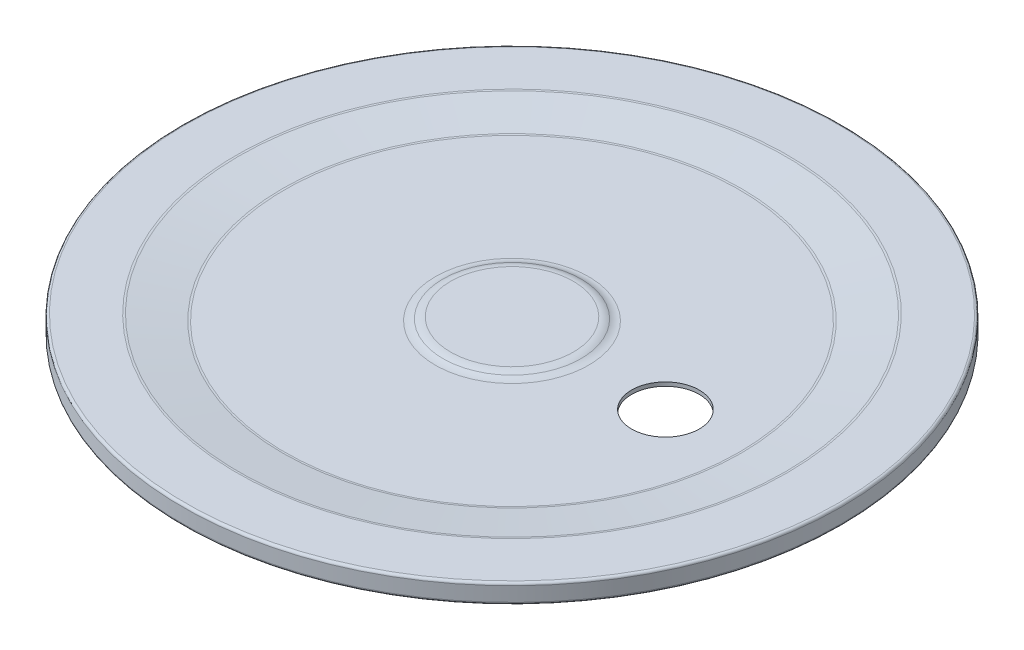
ISO-10303-21;
HEADER;
FILE_DESCRIPTION(('STEP AP214'),'2;1');
FILE_NAME('part.step','',(''),(''),'','','');
FILE_SCHEMA(('AUTOMOTIVE_DESIGN { 1 0 10303 214 1 1 1 1 }'));
ENDSEC;
DATA;
#1=APPLICATION_CONTEXT('core data for automotive mechanical design processes');
#2=APPLICATION_PROTOCOL_DEFINITION('international standard','automotive_design',2000,#1);
#3=PRODUCT_CONTEXT('',#1,'mechanical');
#4=PRODUCT('Part','Part','',(#3));
#5=PRODUCT_RELATED_PRODUCT_CATEGORY('part','',(#4));
#6=PRODUCT_DEFINITION_FORMATION('','',#4);
#7=PRODUCT_DEFINITION_CONTEXT('part definition',#1,'design');
#8=PRODUCT_DEFINITION('design','',#6,#7);
#9=PRODUCT_DEFINITION_SHAPE('','',#8);
#10=(LENGTH_UNIT() NAMED_UNIT(*) SI_UNIT(.MILLI.,.METRE.));
#11=(NAMED_UNIT(*) PLANE_ANGLE_UNIT() SI_UNIT($,.RADIAN.));
#12=(NAMED_UNIT(*) SI_UNIT($,.STERADIAN.) SOLID_ANGLE_UNIT());
#13=UNCERTAINTY_MEASURE_WITH_UNIT(LENGTH_MEASURE(1.E-05),#10,'distance_accuracy_value','');
#14=(GEOMETRIC_REPRESENTATION_CONTEXT(3) GLOBAL_UNCERTAINTY_ASSIGNED_CONTEXT((#13)) GLOBAL_UNIT_ASSIGNED_CONTEXT((#10,
#11,#12)) REPRESENTATION_CONTEXT('',''));
#15=CARTESIAN_POINT('',(0.,0.,0.));
#16=DIRECTION('',(0.,0.,1.));
#17=DIRECTION('',(1.,0.,0.));
#18=AXIS2_PLACEMENT_3D('',#15,#16,#17);
#19=CARTESIAN_POINT('',(0.,81.3593749999999,0.));
#20=DIRECTION('',(0.,1.,0.));
#21=DIRECTION('',(-1.,0.,0.));
#22=AXIS2_PLACEMENT_3D('',#19,#20,#21);
#23=CONICAL_SURFACE('',#22,28.4113417745367,1.4382447944982);
#24=CARTESIAN_POINT('',(0.,81.295875,0.));
#25=DIRECTION('',(0.,1.,0.));
#26=DIRECTION('',(-1.,0.,0.));
#27=AXIS2_PLACEMENT_3D('',#24,#25,#26);
#28=CIRCLE('',#27,27.9350917745368);
#29=CARTESIAN_POINT('',(-27.9350917745368,81.2958749999999,0.));
#30=VERTEX_POINT('',#29);
#31=EDGE_CURVE('E72',#30,#30,#28,.T.);
#32=ORIENTED_EDGE('',*,*,#31,.F.);
#33=EDGE_LOOP('',(#32));
#34=FACE_BOUND('',#33,.T.);
#35=CARTESIAN_POINT('',(0.,81.3593749999999,0.));
#36=DIRECTION('',(0.,1.,0.));
#37=DIRECTION('',(-1.,0.,0.));
#38=AXIS2_PLACEMENT_3D('',#35,#36,#37);
#39=CIRCLE('',#38,28.4113417745367);
#40=CARTESIAN_POINT('',(-28.4113417745367,81.3593749999999,0.));
#41=VERTEX_POINT('',#40);
#42=EDGE_CURVE('E11',#41,#41,#39,.T.);
#43=ORIENTED_EDGE('',*,*,#42,.T.);
#44=EDGE_LOOP('',(#43));
#45=FACE_BOUND('',#44,.T.);
#46=ADVANCED_FACE('F50',(#34,#45),#23,.F.);
#47=CARTESIAN_POINT('',(28.4113417745367,81.359375,0.));
#48=DIRECTION('',(0.,-1.,0.));
#49=DIRECTION('',(1.,0.,0.));
#50=AXIS2_PLACEMENT_3D('',#47,#48,#49);
#51=PLANE('',#50);
#52=ORIENTED_EDGE('',*,*,#42,.F.);
#53=EDGE_LOOP('',(#52));
#54=FACE_BOUND('',#53,.T.);
#55=CARTESIAN_POINT('',(0.,81.3593749999999,0.));
#56=DIRECTION('',(0.,1.,0.));
#57=DIRECTION('',(-1.,0.,0.));
#58=AXIS2_PLACEMENT_3D('',#55,#56,#57);
#59=CIRCLE('',#58,33.703125);
#60=CARTESIAN_POINT('',(-33.703125,81.3593749999999,0.));
#61=VERTEX_POINT('',#60);
#62=EDGE_CURVE('E56',#61,#61,#59,.T.);
#63=ORIENTED_EDGE('',*,*,#62,.T.);
#64=EDGE_LOOP('',(#63));
#65=FACE_BOUND('',#64,.T.);
#66=ADVANCED_FACE('F79',(#54,#65),#51,.F.);
#67=CARTESIAN_POINT('',(0.,82.55,0.));
#68=DIRECTION('',(0.,1.,0.));
#69=DIRECTION('',(-1.,0.,0.));
#70=AXIS2_PLACEMENT_3D('',#67,#68,#69);
#71=CYLINDRICAL_SURFACE('',#70,33.703125);
#72=ORIENTED_EDGE('',*,*,#62,.F.);
#73=EDGE_LOOP('',(#72));
#74=FACE_BOUND('',#73,.T.);
#75=CARTESIAN_POINT('',(0.,80.0893749999999,0.));
#76=DIRECTION('',(0.,1.,0.));
#77=DIRECTION('',(-1.,0.,0.));
#78=AXIS2_PLACEMENT_3D('',#75,#76,#77);
#79=CIRCLE('',#78,33.703125);
#80=CARTESIAN_POINT('',(-33.7031250000001,80.0893749999999,0.));
#81=VERTEX_POINT('',#80);
#82=EDGE_CURVE('E60',#81,#81,#79,.T.);
#83=ORIENTED_EDGE('',*,*,#82,.T.);
#84=EDGE_LOOP('',(#83));
#85=FACE_BOUND('',#84,.T.);
#86=ADVANCED_FACE('F83',(#74,#85),#71,.T.);
#87=CARTESIAN_POINT('',(0.,80.089375,0.));
#88=DIRECTION('',(0.,1.,0.));
#89=DIRECTION('',(-1.,0.,0.));
#90=AXIS2_PLACEMENT_3D('',#87,#88,#89);
#91=TOROIDAL_SURFACE('',#90,28.92475,4.77837500000007);
#92=ORIENTED_EDGE('',*,*,#82,.F.);
#93=EDGE_LOOP('',(#92));
#94=FACE_BOUND('',#93,.T.);
#95=CARTESIAN_POINT('',(0.,81.1983494027303,0.));
#96=DIRECTION('',(0.,1.,0.));
#97=DIRECTION('',(-1.,0.,0.));
#98=AXIS2_PLACEMENT_3D('',#95,#96,#97);
#99=CIRCLE('',#98,33.5726574232082);
#100=CARTESIAN_POINT('',(-33.5726574232082,81.1983494027303,0.));
#101=VERTEX_POINT('',#100);
#102=EDGE_CURVE('E64',#101,#101,#99,.T.);
#103=ORIENTED_EDGE('',*,*,#102,.T.);
#104=EDGE_LOOP('',(#103));
#105=FACE_BOUND('',#104,.T.);
#106=ADVANCED_FACE('F88',(#94,#105),#91,.F.);
#107=CARTESIAN_POINT('',(0.,81.1688749999999,0.));
#108=DIRECTION('',(0.,1.,0.));
#109=DIRECTION('',(-1.,0.,0.));
#110=AXIS2_PLACEMENT_3D('',#107,#108,#109);
#111=TOROIDAL_SURFACE('',#110,33.449125,0.127000000000006);
#112=ORIENTED_EDGE('',*,*,#102,.F.);
#113=EDGE_LOOP('',(#112));
#114=FACE_BOUND('',#113,.T.);
#115=CARTESIAN_POINT('',(0.,81.295875,0.));
#116=DIRECTION('',(0.,1.,0.));
#117=DIRECTION('',(-1.,0.,0.));
#118=AXIS2_PLACEMENT_3D('',#115,#116,#117);
#119=CIRCLE('',#118,33.449125);
#120=CARTESIAN_POINT('',(-33.4491250000001,81.2958749999999,0.));
#121=VERTEX_POINT('',#120);
#122=EDGE_CURVE('E69',#121,#121,#119,.T.);
#123=ORIENTED_EDGE('',*,*,#122,.T.);
#124=EDGE_LOOP('',(#123));
#125=FACE_BOUND('',#124,.T.);
#126=ADVANCED_FACE('F94',(#114,#125),#111,.F.);
#127=CARTESIAN_POINT('',(27.9350917745368,81.295875,0.));
#128=DIRECTION('',(0.,1.,0.));
#129=DIRECTION('',(-1.,0.,0.));
#130=AXIS2_PLACEMENT_3D('',#127,#128,#129);
#131=PLANE('',#130);
#132=ORIENTED_EDGE('',*,*,#122,.F.);
#133=EDGE_LOOP('',(#132));
#134=FACE_BOUND('',#133,.T.);
#135=ORIENTED_EDGE('',*,*,#31,.T.);
#136=EDGE_LOOP('',(#135));
#137=FACE_BOUND('',#136,.T.);
#138=ADVANCED_FACE('F76',(#134,#137),#131,.F.);
#139=CLOSED_SHELL('',(#46,#66,#86,#106,#126,#138));
#140=MANIFOLD_SOLID_BREP('B2',#139);
#141=CARTESIAN_POINT('',(0.,81.50225,0.));
#142=DIRECTION('',(0.,-1.,0.));
#143=DIRECTION('',(1.,0.,0.));
#144=AXIS2_PLACEMENT_3D('',#141,#142,#143);
#145=PLANE('',#144);
#146=CARTESIAN_POINT('',(0.,81.5022499999999,0.));
#147=DIRECTION('',(0.,1.,0.));
#148=DIRECTION('',(-1.,0.,0.));
#149=AXIS2_PLACEMENT_3D('',#146,#147,#148);
#150=CIRCLE('',#149,6.35000000000003);
#151=CARTESIAN_POINT('',(-6.35000000000006,81.5022499999999,0.));
#152=VERTEX_POINT('',#151);
#153=EDGE_CURVE('E219',#152,#152,#150,.T.);
#154=ORIENTED_EDGE('',*,*,#153,.T.);
#155=EDGE_LOOP('',(#154));
#156=FACE_BOUND('',#155,.T.);
#157=ADVANCED_FACE('F155',(#156),#145,.F.);
#158=CARTESIAN_POINT('',(0.,79.7533541666666,0.));
#159=DIRECTION('',(0.,1.,0.));
#160=DIRECTION('',(-1.,0.,0.));
#161=AXIS2_PLACEMENT_3D('',#158,#159,#160);
#162=TOROIDAL_SURFACE('',#161,6.35000000000002,1.74889583333333);
#163=ORIENTED_EDGE('',*,*,#153,.F.);
#164=EDGE_LOOP('',(#163));
#165=FACE_BOUND('',#164,.T.);
#166=CARTESIAN_POINT('',(0.,81.3117499999999,0.));
#167=DIRECTION('',(0.,1.,0.));
#168=DIRECTION('',(-1.,0.,0.));
#169=AXIS2_PLACEMENT_3D('',#166,#167,#168);
#170=CIRCLE('',#169,7.14375000000003);
#171=CARTESIAN_POINT('',(-7.14375000000005,81.3117499999999,0.));
#172=VERTEX_POINT('',#171);
#173=EDGE_CURVE('E223',#172,#172,#170,.T.);
#174=ORIENTED_EDGE('',*,*,#173,.T.);
#175=EDGE_LOOP('',(#174));
#176=FACE_BOUND('',#175,.T.);
#177=ADVANCED_FACE('F269',(#165,#176),#162,.T.);
#178=CARTESIAN_POINT('',(0.,82.8701458333333,0.));
#179=DIRECTION('',(0.,1.,0.));
#180=DIRECTION('',(-1.,0.,0.));
#181=AXIS2_PLACEMENT_3D('',#178,#179,#180);
#182=TOROIDAL_SURFACE('',#181,7.93750000000003,1.74889583333333);
#183=ORIENTED_EDGE('',*,*,#173,.F.);
#184=EDGE_LOOP('',(#183));
#185=FACE_BOUND('',#184,.T.);
#186=CARTESIAN_POINT('',(0.,81.1212499999999,0.));
#187=DIRECTION('',(0.,1.,0.));
#188=DIRECTION('',(-1.,0.,0.));
#189=AXIS2_PLACEMENT_3D('',#186,#187,#188);
#190=CIRCLE('',#189,7.93750000000003);
#191=CARTESIAN_POINT('',(-7.93750000000005,81.1212499999999,0.));
#192=VERTEX_POINT('',#191);
#193=EDGE_CURVE('E227',#192,#192,#190,.T.);
#194=ORIENTED_EDGE('',*,*,#193,.T.);
#195=EDGE_LOOP('',(#194));
#196=FACE_BOUND('',#195,.T.);
#197=ADVANCED_FACE('F275',(#185,#196),#182,.F.);
#198=CARTESIAN_POINT('',(7.9375,81.1212499999999,0.));
#199=DIRECTION('',(0.,-1.,0.));
#200=DIRECTION('',(1.,0.,0.));
#201=AXIS2_PLACEMENT_3D('',#198,#199,#200);
#202=PLANE('',#201);
#203=CARTESIAN_POINT('',(15.875,81.12125,0.));
#204=DIRECTION('',(0.,1.,0.));
#205=DIRECTION('',(-1.,0.,0.));
#206=AXIS2_PLACEMENT_3D('',#203,#204,#205);
#207=CIRCLE('',#206,3.499999985);
#208=CARTESIAN_POINT('',(12.375000015,81.12125,0.));
#209=VERTEX_POINT('',#208);
#210=EDGE_CURVE('E247',#209,#209,#207,.T.);
#211=ORIENTED_EDGE('',*,*,#210,.F.);
#212=EDGE_LOOP('',(#211));
#213=FACE_BOUND('',#212,.T.);
#214=CARTESIAN_POINT('',(0.,81.1212499999999,0.));
#215=DIRECTION('',(0.,-1.,0.));
#216=DIRECTION('',(1.,0.,0.));
#217=AXIS2_PLACEMENT_3D('',#214,#215,#216);
#218=CIRCLE('',#217,23.5213475857789);
#219=CARTESIAN_POINT('',(23.5213475857789,81.12125,0.));
#220=VERTEX_POINT('',#219);
#221=EDGE_CURVE('E49',#220,#220,#218,.F.);
#222=ORIENTED_EDGE('',*,*,#221,.T.);
#223=EDGE_LOOP('',(#222));
#224=FACE_BOUND('',#223,.T.);
#225=ORIENTED_EDGE('',*,*,#193,.F.);
#226=EDGE_LOOP('',(#225));
#227=FACE_BOUND('',#226,.T.);
#228=ADVANCED_FACE('F312',(#213,#224,#227),#202,.F.);
#229=CARTESIAN_POINT('',(0.,81.7562499999999,0.));
#230=DIRECTION('',(0.,1.,0.));
#231=DIRECTION('',(-1.,0.,0.));
#232=AXIS2_PLACEMENT_3D('',#229,#230,#231);
#233=CONICAL_SURFACE('',#232,28.385,1.43824479449823);
#234=CARTESIAN_POINT('',(0.,81.7428813206403,0.));
#235=DIRECTION('',(0.,-1.,0.));
#236=DIRECTION('',(1.,0.,0.));
#237=AXIS2_PLACEMENT_3D('',#234,#235,#236);
#238=CIRCLE('',#237,28.2847349048026);
#239=CARTESIAN_POINT('',(28.2847349048025,81.7428813206403,0.));
#240=VERTEX_POINT('',#239);
#241=EDGE_CURVE('E164',#240,#240,#238,.F.);
#242=ORIENTED_EDGE('',*,*,#241,.T.);
#243=EDGE_LOOP('',(#242));
#244=FACE_BOUND('',#243,.T.);
#245=CARTESIAN_POINT('',(0.,81.1346186793596,0.));
#246=DIRECTION('',(0.,1.,0.));
#247=DIRECTION('',(-1.,0.,0.));
#248=AXIS2_PLACEMENT_3D('',#245,#246,#247);
#249=CIRCLE('',#248,23.7227650951976);
#250=CARTESIAN_POINT('',(-23.7227650951976,81.1346186793595,0.));
#251=VERTEX_POINT('',#250);
#252=EDGE_CURVE('E169',#251,#251,#249,.F.);
#253=ORIENTED_EDGE('',*,*,#252,.T.);
#254=EDGE_LOOP('',(#253));
#255=FACE_BOUND('',#254,.T.);
#256=ADVANCED_FACE('F308',(#244,#255),#233,.F.);
#257=CARTESIAN_POINT('',(28.385,81.75625,0.));
#258=DIRECTION('',(0.,-1.,0.));
#259=DIRECTION('',(1.,0.,0.));
#260=AXIS2_PLACEMENT_3D('',#257,#258,#259);
#261=PLANE('',#260);
#262=CARTESIAN_POINT('',(0.,81.7562499999999,0.));
#263=DIRECTION('',(0.,-1.,0.));
#264=DIRECTION('',(1.,0.,0.));
#265=AXIS2_PLACEMENT_3D('',#262,#263,#264);
#266=CIRCLE('',#265,33.846);
#267=CARTESIAN_POINT('',(33.846,81.75625,0.));
#268=VERTEX_POINT('',#267);
#269=EDGE_CURVE('E187',#268,#268,#266,.F.);
#270=ORIENTED_EDGE('',*,*,#269,.T.);
#271=EDGE_LOOP('',(#270));
#272=FACE_BOUND('',#271,.T.);
#273=CARTESIAN_POINT('',(0.,81.7562499999999,0.));
#274=DIRECTION('',(0.,-1.,0.));
#275=DIRECTION('',(1.,0.,0.));
#276=AXIS2_PLACEMENT_3D('',#273,#274,#275);
#277=CIRCLE('',#276,28.4861524142213);
#278=CARTESIAN_POINT('',(28.4861524142212,81.75625,0.));
#279=VERTEX_POINT('',#278);
#280=EDGE_CURVE('E191',#279,#279,#277,.T.);
#281=ORIENTED_EDGE('',*,*,#280,.T.);
#282=EDGE_LOOP('',(#281));
#283=FACE_BOUND('',#282,.T.);
#284=ADVANCED_FACE('F311',(#272,#283),#261,.F.);
#285=CARTESIAN_POINT('',(0.,82.55,0.));
#286=DIRECTION('',(0.,1.,0.));
#287=DIRECTION('',(-1.,0.,0.));
#288=AXIS2_PLACEMENT_3D('',#285,#286,#287);
#289=CYLINDRICAL_SURFACE('',#288,34.1);
#290=CARTESIAN_POINT('',(0.,80.0102499999999,0.));
#291=DIRECTION('',(0.,1.,0.));
#292=DIRECTION('',(-1.,0.,0.));
#293=AXIS2_PLACEMENT_3D('',#290,#291,#292);
#294=CIRCLE('',#293,34.1);
#295=CARTESIAN_POINT('',(-34.1000000000001,80.0102499999999,0.));
#296=VERTEX_POINT('',#295);
#297=EDGE_CURVE('E211',#296,#296,#294,.T.);
#298=ORIENTED_EDGE('',*,*,#297,.T.);
#299=EDGE_LOOP('',(#298));
#300=FACE_BOUND('',#299,.T.);
#301=CARTESIAN_POINT('',(0.,81.5022499999999,0.));
#302=DIRECTION('',(0.,-1.,0.));
#303=DIRECTION('',(1.,0.,0.));
#304=AXIS2_PLACEMENT_3D('',#301,#302,#303);
#305=CIRCLE('',#304,34.1);
#306=CARTESIAN_POINT('',(34.1,81.50225,0.));
#307=VERTEX_POINT('',#306);
#308=EDGE_CURVE('E215',#307,#307,#305,.T.);
#309=ORIENTED_EDGE('',*,*,#308,.T.);
#310=EDGE_LOOP('',(#309));
#311=FACE_BOUND('',#310,.T.);
#312=ADVANCED_FACE('F320',(#300,#311),#289,.T.);
#313=CARTESIAN_POINT('',(34.1,79.75625,0.));
#314=DIRECTION('',(0.,1.,0.));
#315=DIRECTION('',(-1.,0.,0.));
#316=AXIS2_PLACEMENT_3D('',#313,#314,#315);
#317=PLANE('',#316);
#318=CARTESIAN_POINT('',(0.,79.7562499999999,0.));
#319=DIRECTION('',(0.,1.,0.));
#320=DIRECTION('',(-1.,0.,0.));
#321=AXIS2_PLACEMENT_3D('',#318,#319,#320);
#322=CIRCLE('',#321,33.846);
#323=CARTESIAN_POINT('',(-33.8460000000001,79.7562499999999,0.));
#324=VERTEX_POINT('',#323);
#325=EDGE_CURVE('E207',#324,#324,#322,.F.);
#326=ORIENTED_EDGE('',*,*,#325,.T.);
#327=EDGE_LOOP('',(#326));
#328=FACE_BOUND('',#327,.T.);
#329=CARTESIAN_POINT('',(0.,79.7562499999999,0.));
#330=DIRECTION('',(0.,1.,0.));
#331=DIRECTION('',(-1.,0.,0.));
#332=AXIS2_PLACEMENT_3D('',#329,#330,#331);
#333=CIRCLE('',#332,33.703125);
#334=CARTESIAN_POINT('',(-33.7031250000001,79.7562499999999,0.));
#335=VERTEX_POINT('',#334);
#336=EDGE_CURVE('E231',#335,#335,#333,.T.);
#337=ORIENTED_EDGE('',*,*,#336,.T.);
#338=EDGE_LOOP('',(#337));
#339=FACE_BOUND('',#338,.T.);
#340=ADVANCED_FACE('F476',(#328,#339),#317,.F.);
#341=CARTESIAN_POINT('',(0.,82.55,0.));
#342=DIRECTION('',(0.,1.,0.));
#343=DIRECTION('',(-1.,0.,0.));
#344=AXIS2_PLACEMENT_3D('',#341,#342,#343);
#345=CYLINDRICAL_SURFACE('',#344,33.703125);
#346=CARTESIAN_POINT('',(0.,81.1053749999999,0.));
#347=DIRECTION('',(0.,1.,0.));
#348=DIRECTION('',(-1.,0.,0.));
#349=AXIS2_PLACEMENT_3D('',#346,#347,#348);
#350=CIRCLE('',#349,33.703125);
#351=CARTESIAN_POINT('',(-33.7031250000001,81.1053749999998,0.));
#352=VERTEX_POINT('',#351);
#353=EDGE_CURVE('E203',#352,#352,#350,.T.);
#354=ORIENTED_EDGE('',*,*,#353,.T.);
#355=EDGE_LOOP('',(#354));
#356=FACE_BOUND('',#355,.T.);
#357=ORIENTED_EDGE('',*,*,#336,.F.);
#358=EDGE_LOOP('',(#357));
#359=FACE_BOUND('',#358,.T.);
#360=ADVANCED_FACE('F466',(#356,#359),#345,.F.);
#361=CARTESIAN_POINT('',(28.4113417745367,81.359375,0.));
#362=DIRECTION('',(0.,1.,0.));
#363=DIRECTION('',(-1.,0.,0.));
#364=AXIS2_PLACEMENT_3D('',#361,#362,#363);
#365=PLANE('',#364);
#366=CARTESIAN_POINT('',(0.,81.3593749999999,0.));
#367=DIRECTION('',(0.,1.,0.));
#368=DIRECTION('',(-1.,0.,0.));
#369=AXIS2_PLACEMENT_3D('',#366,#367,#368);
#370=CIRCLE('',#369,33.449125);
#371=CARTESIAN_POINT('',(-33.4491250000001,81.3593749999998,0.));
#372=VERTEX_POINT('',#371);
#373=EDGE_CURVE('E195',#372,#372,#370,.F.);
#374=ORIENTED_EDGE('',*,*,#373,.T.);
#375=EDGE_LOOP('',(#374));
#376=FACE_BOUND('',#375,.T.);
#377=CARTESIAN_POINT('',(0.,81.3593749999999,0.));
#378=DIRECTION('',(0.,1.,0.));
#379=DIRECTION('',(-1.,0.,0.));
#380=AXIS2_PLACEMENT_3D('',#377,#378,#379);
#381=CIRCLE('',#380,28.512494188758);
#382=CARTESIAN_POINT('',(-28.512494188758,81.3593749999998,0.));
#383=VERTEX_POINT('',#382);
#384=EDGE_CURVE('E199',#383,#383,#381,.T.);
#385=ORIENTED_EDGE('',*,*,#384,.T.);
#386=EDGE_LOOP('',(#385));
#387=FACE_BOUND('',#386,.T.);
#388=ADVANCED_FACE('F457',(#376,#387),#365,.F.);
#389=CARTESIAN_POINT('',(0.,80.7243749999999,0.));
#390=DIRECTION('',(0.,1.,0.));
#391=DIRECTION('',(-1.,0.,0.));
#392=AXIS2_PLACEMENT_3D('',#389,#390,#391);
#393=CONICAL_SURFACE('',#392,23.6488417745368,1.43824479449823);
#394=CARTESIAN_POINT('',(0.,81.3460063206402,0.));
#395=DIRECTION('',(0.,1.,0.));
#396=DIRECTION('',(-1.,0.,0.));
#397=AXIS2_PLACEMENT_3D('',#394,#395,#396);
#398=CIRCLE('',#397,28.3110766793393);
#399=CARTESIAN_POINT('',(-28.3110766793393,81.3460063206402,0.));
#400=VERTEX_POINT('',#399);
#401=EDGE_CURVE('E179',#400,#400,#398,.F.);
#402=ORIENTED_EDGE('',*,*,#401,.T.);
#403=EDGE_LOOP('',(#402));
#404=FACE_BOUND('',#403,.T.);
#405=CARTESIAN_POINT('',(0.,80.7377436793596,0.));
#406=DIRECTION('',(0.,-1.,0.));
#407=DIRECTION('',(1.,0.,0.));
#408=AXIS2_PLACEMENT_3D('',#405,#406,#407);
#409=CIRCLE('',#408,23.7491068697344);
#410=CARTESIAN_POINT('',(23.7491068697344,80.7377436793596,0.));
#411=VERTEX_POINT('',#410);
#412=EDGE_CURVE('E183',#411,#411,#409,.F.);
#413=ORIENTED_EDGE('',*,*,#412,.T.);
#414=EDGE_LOOP('',(#413));
#415=FACE_BOUND('',#414,.T.);
#416=ADVANCED_FACE('F356',(#404,#415),#393,.T.);
#417=CARTESIAN_POINT('',(7.9375,80.724375,0.));
#418=DIRECTION('',(0.,1.,0.));
#419=DIRECTION('',(-1.,0.,0.));
#420=AXIS2_PLACEMENT_3D('',#417,#418,#419);
#421=PLANE('',#420);
#422=CARTESIAN_POINT('',(15.875,80.724375,0.));
#423=DIRECTION('',(0.,1.,0.));
#424=DIRECTION('',(-1.,0.,0.));
#425=AXIS2_PLACEMENT_3D('',#422,#423,#424);
#426=CIRCLE('',#425,3.499999985);
#427=CARTESIAN_POINT('',(12.375000015,80.724375,0.));
#428=VERTEX_POINT('',#427);
#429=EDGE_CURVE('E159',#428,#428,#426,.T.);
#430=ORIENTED_EDGE('',*,*,#429,.T.);
#431=EDGE_LOOP('',(#430));
#432=FACE_BOUND('',#431,.T.);
#433=CARTESIAN_POINT('',(0.,80.7243749999999,0.));
#434=DIRECTION('',(0.,1.,0.));
#435=DIRECTION('',(-1.,0.,0.));
#436=AXIS2_PLACEMENT_3D('',#433,#434,#435);
#437=CIRCLE('',#436,23.5476893603157);
#438=CARTESIAN_POINT('',(-23.5476893603157,80.7243749999999,0.));
#439=VERTEX_POINT('',#438);
#440=EDGE_CURVE('E175',#439,#439,#437,.F.);
#441=ORIENTED_EDGE('',*,*,#440,.T.);
#442=EDGE_LOOP('',(#441));
#443=FACE_BOUND('',#442,.T.);
#444=CARTESIAN_POINT('',(0.,80.724375,0.));
#445=DIRECTION('',(0.,1.,0.));
#446=DIRECTION('',(-1.,0.,0.));
#447=AXIS2_PLACEMENT_3D('',#444,#445,#446);
#448=CIRCLE('',#447,7.93750000000003);
#449=CARTESIAN_POINT('',(-7.93750000000005,80.7243749999999,0.));
#450=VERTEX_POINT('',#449);
#451=EDGE_CURVE('E235',#450,#450,#448,.T.);
#452=ORIENTED_EDGE('',*,*,#451,.T.);
#453=EDGE_LOOP('',(#452));
#454=FACE_BOUND('',#453,.T.);
#455=ADVANCED_FACE('F256',(#432,#443,#454),#421,.F.);
#456=CARTESIAN_POINT('',(0.,82.8701458333333,0.));
#457=DIRECTION('',(0.,1.,0.));
#458=DIRECTION('',(-1.,0.,0.));
#459=AXIS2_PLACEMENT_3D('',#456,#457,#458);
#460=TOROIDAL_SURFACE('',#459,7.93750000000003,2.14577083333334);
#461=ORIENTED_EDGE('',*,*,#451,.F.);
#462=EDGE_LOOP('',(#461));
#463=FACE_BOUND('',#462,.T.);
#464=CARTESIAN_POINT('',(0.,80.9581049546142,0.));
#465=DIRECTION('',(0.,1.,0.));
#466=DIRECTION('',(-1.,0.,0.));
#467=AXIS2_PLACEMENT_3D('',#464,#465,#466);
#468=CIRCLE('',#467,6.96362518910744);
#469=CARTESIAN_POINT('',(-6.96362518910746,80.9581049546142,0.));
#470=VERTEX_POINT('',#469);
#471=EDGE_CURVE('E239',#470,#470,#468,.T.);
#472=ORIENTED_EDGE('',*,*,#471,.T.);
#473=EDGE_LOOP('',(#472));
#474=FACE_BOUND('',#473,.T.);
#475=ADVANCED_FACE('F355',(#463,#474),#460,.T.);
#476=CARTESIAN_POINT('',(0.,79.7533541666666,0.));
#477=DIRECTION('',(0.,1.,0.));
#478=DIRECTION('',(-1.,0.,0.));
#479=AXIS2_PLACEMENT_3D('',#476,#477,#478);
#480=TOROIDAL_SURFACE('',#479,6.35000000000002,1.35202083333334);
#481=ORIENTED_EDGE('',*,*,#471,.F.);
#482=EDGE_LOOP('',(#481));
#483=FACE_BOUND('',#482,.T.);
#484=CARTESIAN_POINT('',(0.,81.105375,0.));
#485=DIRECTION('',(0.,1.,0.));
#486=DIRECTION('',(-1.,0.,0.));
#487=AXIS2_PLACEMENT_3D('',#484,#485,#486);
#488=CIRCLE('',#487,6.35000000000003);
#489=CARTESIAN_POINT('',(-6.35000000000005,81.1053749999999,0.));
#490=VERTEX_POINT('',#489);
#491=EDGE_CURVE('E243',#490,#490,#488,.T.);
#492=ORIENTED_EDGE('',*,*,#491,.T.);
#493=EDGE_LOOP('',(#492));
#494=FACE_BOUND('',#493,.T.);
#495=ADVANCED_FACE('F425',(#483,#494),#480,.F.);
#496=CARTESIAN_POINT('',(0.,81.105375,0.));
#497=DIRECTION('',(0.,1.,0.));
#498=DIRECTION('',(-1.,0.,0.));
#499=AXIS2_PLACEMENT_3D('',#496,#497,#498);
#500=PLANE('',#499);
#501=ORIENTED_EDGE('',*,*,#491,.F.);
#502=EDGE_LOOP('',(#501));
#503=FACE_BOUND('',#502,.T.);
#504=ADVANCED_FACE('F284',(#503),#500,.F.);
#505=CARTESIAN_POINT('',(0.,80.0102499999999,0.));
#506=DIRECTION('',(0.,1.,0.));
#507=DIRECTION('',(-1.,0.,0.));
#508=AXIS2_PLACEMENT_3D('',#505,#506,#507);
#509=TOROIDAL_SURFACE('',#508,33.846,0.254);
#510=ORIENTED_EDGE('',*,*,#325,.F.);
#511=EDGE_LOOP('',(#510));
#512=FACE_BOUND('',#511,.T.);
#513=ORIENTED_EDGE('',*,*,#297,.F.);
#514=EDGE_LOOP('',(#513));
#515=FACE_BOUND('',#514,.T.);
#516=ADVANCED_FACE('F280',(#512,#515),#509,.T.);
#517=CARTESIAN_POINT('',(0.,81.1053749999999,0.));
#518=DIRECTION('',(0.,1.,0.));
#519=DIRECTION('',(-1.,0.,0.));
#520=AXIS2_PLACEMENT_3D('',#517,#518,#519);
#521=TOROIDAL_SURFACE('',#520,33.449125,0.254);
#522=ORIENTED_EDGE('',*,*,#373,.F.);
#523=EDGE_LOOP('',(#522));
#524=FACE_BOUND('',#523,.T.);
#525=ORIENTED_EDGE('',*,*,#353,.F.);
#526=EDGE_LOOP('',(#525));
#527=FACE_BOUND('',#526,.T.);
#528=ADVANCED_FACE('F283',(#524,#527),#521,.F.);
#529=CARTESIAN_POINT('',(0.,81.5022499999999,0.));
#530=DIRECTION('',(0.,-1.,0.));
#531=DIRECTION('',(1.,0.,0.));
#532=AXIS2_PLACEMENT_3D('',#529,#530,#531);
#533=TOROIDAL_SURFACE('',#532,33.846,0.254);
#534=ORIENTED_EDGE('',*,*,#308,.F.);
#535=EDGE_LOOP('',(#534));
#536=FACE_BOUND('',#535,.T.);
#537=ORIENTED_EDGE('',*,*,#269,.F.);
#538=EDGE_LOOP('',(#537));
#539=FACE_BOUND('',#538,.T.);
#540=ADVANCED_FACE('F288',(#536,#539),#533,.T.);
#541=CARTESIAN_POINT('',(0.,79.8353749999999,0.));
#542=DIRECTION('',(0.,1.,0.));
#543=DIRECTION('',(-1.,0.,0.));
#544=AXIS2_PLACEMENT_3D('',#541,#542,#543);
#545=TOROIDAL_SURFACE('',#544,28.512494188758,1.524);
#546=ORIENTED_EDGE('',*,*,#401,.F.);
#547=EDGE_LOOP('',(#546));
#548=FACE_BOUND('',#547,.T.);
#549=ORIENTED_EDGE('',*,*,#384,.F.);
#550=EDGE_LOOP('',(#549));
#551=FACE_BOUND('',#550,.T.);
#552=ADVANCED_FACE('F292',(#548,#551),#545,.F.);
#553=CARTESIAN_POINT('',(0.,82.2483749999999,0.));
#554=DIRECTION('',(0.,1.,0.));
#555=DIRECTION('',(-1.,0.,0.));
#556=AXIS2_PLACEMENT_3D('',#553,#554,#555);
#557=TOROIDAL_SURFACE('',#556,23.5476893603157,1.524);
#558=ORIENTED_EDGE('',*,*,#440,.F.);
#559=EDGE_LOOP('',(#558));
#560=FACE_BOUND('',#559,.T.);
#561=ORIENTED_EDGE('',*,*,#412,.F.);
#562=EDGE_LOOP('',(#561));
#563=FACE_BOUND('',#562,.T.);
#564=ADVANCED_FACE('F296',(#560,#563),#557,.T.);
#565=CARTESIAN_POINT('',(0.,80.2322499999999,0.));
#566=DIRECTION('',(0.,-1.,0.));
#567=DIRECTION('',(1.,0.,0.));
#568=AXIS2_PLACEMENT_3D('',#565,#566,#567);
#569=TOROIDAL_SURFACE('',#568,28.4861524142213,1.524);
#570=ORIENTED_EDGE('',*,*,#280,.F.);
#571=EDGE_LOOP('',(#570));
#572=FACE_BOUND('',#571,.T.);
#573=ORIENTED_EDGE('',*,*,#241,.F.);
#574=EDGE_LOOP('',(#573));
#575=FACE_BOUND('',#574,.T.);
#576=ADVANCED_FACE('F265',(#572,#575),#569,.T.);
#577=CARTESIAN_POINT('',(0.,82.6452499999999,0.));
#578=DIRECTION('',(0.,-1.,0.));
#579=DIRECTION('',(1.,0.,0.));
#580=AXIS2_PLACEMENT_3D('',#577,#578,#579);
#581=TOROIDAL_SURFACE('',#580,23.5213475857789,1.524);
#582=ORIENTED_EDGE('',*,*,#252,.F.);
#583=EDGE_LOOP('',(#582));
#584=FACE_BOUND('',#583,.T.);
#585=ORIENTED_EDGE('',*,*,#221,.F.);
#586=EDGE_LOOP('',(#585));
#587=FACE_BOUND('',#586,.T.);
#588=ADVANCED_FACE('F157',(#584,#587),#581,.F.);
#589=CARTESIAN_POINT('',(15.875,78.58125,0.));
#590=DIRECTION('',(0.,1.,0.));
#591=DIRECTION('',(-1.,0.,0.));
#592=AXIS2_PLACEMENT_3D('',#589,#590,#591);
#593=CYLINDRICAL_SURFACE('',#592,3.499999985);
#594=ORIENTED_EDGE('',*,*,#210,.T.);
#595=EDGE_LOOP('',(#594));
#596=FACE_BOUND('',#595,.T.);
#597=ORIENTED_EDGE('',*,*,#429,.F.);
#598=EDGE_LOOP('',(#597));
#599=FACE_BOUND('',#598,.T.);
#600=ADVANCED_FACE('F259',(#596,#599),#593,.F.);
#601=CLOSED_SHELL('',(#157,#177,#197,#228,#256,#284,#312,#340,#360,#388,#416,#455,#475,#495,
#504,#516,#528,#540,#552,#564,#576,#588,#600));
#602=MANIFOLD_SOLID_BREP('B6',#601);
#603=ADVANCED_BREP_SHAPE_REPRESENTATION('',(#18,#140,#602),#14);
#604=SHAPE_DEFINITION_REPRESENTATION(#9,#603);
ENDSEC;
END-ISO-10303-21;
